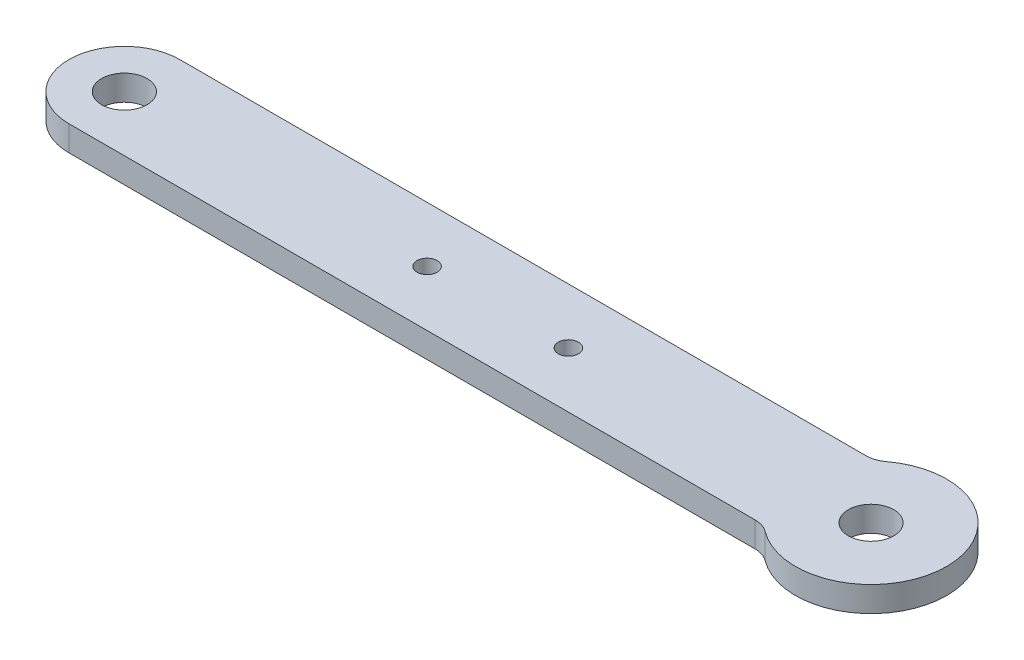
ISO-10303-21;
HEADER;
FILE_DESCRIPTION(('STEP AP214'),'2;1');
FILE_NAME('part.step','',(''),(''),'','','');
FILE_SCHEMA(('AUTOMOTIVE_DESIGN { 1 0 10303 214 1 1 1 1 }'));
ENDSEC;
DATA;
#1=APPLICATION_CONTEXT('core data for automotive mechanical design processes');
#2=APPLICATION_PROTOCOL_DEFINITION('international standard','automotive_design',2000,#1);
#3=PRODUCT_CONTEXT('',#1,'mechanical');
#4=PRODUCT('Part','Part','',(#3));
#5=PRODUCT_RELATED_PRODUCT_CATEGORY('part','',(#4));
#6=PRODUCT_DEFINITION_FORMATION('','',#4);
#7=PRODUCT_DEFINITION_CONTEXT('part definition',#1,'design');
#8=PRODUCT_DEFINITION('design','',#6,#7);
#9=PRODUCT_DEFINITION_SHAPE('','',#8);
#10=(LENGTH_UNIT() NAMED_UNIT(*) SI_UNIT(.MILLI.,.METRE.));
#11=(NAMED_UNIT(*) PLANE_ANGLE_UNIT() SI_UNIT($,.RADIAN.));
#12=(NAMED_UNIT(*) SI_UNIT($,.STERADIAN.) SOLID_ANGLE_UNIT());
#13=UNCERTAINTY_MEASURE_WITH_UNIT(LENGTH_MEASURE(1.E-05),#10,'distance_accuracy_value','');
#14=(GEOMETRIC_REPRESENTATION_CONTEXT(3) GLOBAL_UNCERTAINTY_ASSIGNED_CONTEXT((#13)) GLOBAL_UNIT_ASSIGNED_CONTEXT((#10,
#11,#12)) REPRESENTATION_CONTEXT('',''));
#15=CARTESIAN_POINT('',(0.,0.,0.));
#16=DIRECTION('',(0.,0.,1.));
#17=DIRECTION('',(1.,0.,0.));
#18=AXIS2_PLACEMENT_3D('',#15,#16,#17);
#19=CARTESIAN_POINT('',(-64.2326621923937,5.,-8.03803131991051));
#20=DIRECTION('',(0.,1.,0.));
#21=DIRECTION('',(0.,0.,1.));
#22=AXIS2_PLACEMENT_3D('',#19,#20,#21);
#23=PLANE('',#22);
#24=CARTESIAN_POINT('',(-4.23266219239372,5.,-8.03803131991051));
#25=DIRECTION('',(0.,1.,0.));
#26=DIRECTION('',(0.,0.,1.));
#27=AXIS2_PLACEMENT_3D('',#24,#25,#26);
#28=CIRCLE('',#27,2.);
#29=CARTESIAN_POINT('',(-4.23266219239372,5.,-6.03803131991051));
#30=VERTEX_POINT('',#29);
#31=EDGE_CURVE('E193',#30,#30,#28,.T.);
#32=ORIENTED_EDGE('',*,*,#31,.F.);
#33=EDGE_LOOP('',(#32));
#34=FACE_BOUND('',#33,.T.);
#35=CARTESIAN_POINT('',(-64.2326621923937,5.,-8.03803131991051));
#36=DIRECTION('',(0.,1.,0.));
#37=DIRECTION('',(0.,0.,1.));
#38=AXIS2_PLACEMENT_3D('',#35,#36,#37);
#39=CIRCLE('',#38,4.5);
#40=CARTESIAN_POINT('',(-64.2326621923937,5.,-3.53803131991051));
#41=VERTEX_POINT('',#40);
#42=EDGE_CURVE('E126',#41,#41,#39,.T.);
#43=ORIENTED_EDGE('',*,*,#42,.F.);
#44=EDGE_LOOP('',(#43));
#45=FACE_BOUND('',#44,.T.);
#46=CARTESIAN_POINT('',(-64.2326621923937,5.,-8.03803131991051));
#47=DIRECTION('',(0.,1.,0.));
#48=DIRECTION('',(0.,0.,1.));
#49=AXIS2_PLACEMENT_3D('',#46,#47,#48);
#50=CIRCLE('',#49,11.);
#51=CARTESIAN_POINT('',(-64.2326621923937,5.,-19.0380313199105));
#52=VERTEX_POINT('',#51);
#53=CARTESIAN_POINT('',(-64.2326621923937,5.,2.96196868008949));
#54=VERTEX_POINT('',#53);
#55=EDGE_CURVE('E133',#52,#54,#50,.T.);
#56=ORIENTED_EDGE('',*,*,#55,.T.);
#57=DIRECTION('',(1.,0.,0.));
#58=VECTOR('',#57,1.);
#59=CARTESIAN_POINT('',(71.7673378076063,5.,2.96196868008949));
#60=LINE('',#59,#58);
#61=CARTESIAN_POINT('',(71.7673378076063,5.,2.96196868008949));
#62=VERTEX_POINT('',#61);
#63=EDGE_CURVE('E91',#54,#62,#60,.T.);
#64=ORIENTED_EDGE('',*,*,#63,.T.);
#65=CARTESIAN_POINT('',(71.7673378076063,5.,7.96196868008949));
#66=DIRECTION('',(0.,-1.,0.));
#67=DIRECTION('',(0.,0.,-1.));
#68=AXIS2_PLACEMENT_3D('',#65,#66,#67);
#69=CIRCLE('',#68,5.);
#70=CARTESIAN_POINT('',(74.7673378076063,5.,3.96196868008949));
#71=VERTEX_POINT('',#70);
#72=EDGE_CURVE('E104',#62,#71,#69,.T.);
#73=ORIENTED_EDGE('',*,*,#72,.T.);
#74=CARTESIAN_POINT('',(83.7673378076063,5.,-8.03803131991051));
#75=DIRECTION('',(0.,1.,0.));
#76=DIRECTION('',(0.,0.,1.));
#77=AXIS2_PLACEMENT_3D('',#74,#75,#76);
#78=CIRCLE('',#77,15.);
#79=CARTESIAN_POINT('',(74.7673378076063,5.,-20.0380313199105));
#80=VERTEX_POINT('',#79);
#81=EDGE_CURVE('E98',#71,#80,#78,.T.);
#82=ORIENTED_EDGE('',*,*,#81,.T.);
#83=CARTESIAN_POINT('',(71.7673378076063,5.,-24.0380313199105));
#84=DIRECTION('',(0.,-1.,0.));
#85=DIRECTION('',(0.,0.,1.));
#86=AXIS2_PLACEMENT_3D('',#83,#84,#85);
#87=CIRCLE('',#86,5.);
#88=CARTESIAN_POINT('',(71.7673378076063,5.,-19.0380313199105));
#89=VERTEX_POINT('',#88);
#90=EDGE_CURVE('E102',#80,#89,#87,.T.);
#91=ORIENTED_EDGE('',*,*,#90,.T.);
#92=DIRECTION('',(-1.,0.,0.));
#93=VECTOR('',#92,1.);
#94=CARTESIAN_POINT('',(-64.2326621923937,5.,-19.0380313199105));
#95=LINE('',#94,#93);
#96=EDGE_CURVE('E54',#89,#52,#95,.T.);
#97=ORIENTED_EDGE('',*,*,#96,.T.);
#98=EDGE_LOOP('',(#56,#64,#73,#82,#91,#97));
#99=FACE_BOUND('',#98,.T.);
#100=CARTESIAN_POINT('',(83.7673378076063,5.,-8.03803131991051));
#101=DIRECTION('',(0.,1.,0.));
#102=DIRECTION('',(0.,0.,1.));
#103=AXIS2_PLACEMENT_3D('',#100,#101,#102);
#104=CIRCLE('',#103,4.5);
#105=CARTESIAN_POINT('',(83.7673378076063,5.,-3.5380313199105));
#106=VERTEX_POINT('',#105);
#107=EDGE_CURVE('E199',#106,#106,#104,.T.);
#108=ORIENTED_EDGE('',*,*,#107,.F.);
#109=EDGE_LOOP('',(#108));
#110=FACE_BOUND('',#109,.T.);
#111=CARTESIAN_POINT('',(23.7673378076063,5.,-8.03803131991051));
#112=DIRECTION('',(0.,1.,0.));
#113=DIRECTION('',(0.,0.,1.));
#114=AXIS2_PLACEMENT_3D('',#111,#112,#113);
#115=CIRCLE('',#114,2.);
#116=CARTESIAN_POINT('',(23.7673378076063,5.,-6.03803131991051));
#117=VERTEX_POINT('',#116);
#118=EDGE_CURVE('E184',#117,#117,#115,.T.);
#119=ORIENTED_EDGE('',*,*,#118,.F.);
#120=EDGE_LOOP('',(#119));
#121=FACE_BOUND('',#120,.T.);
#122=ADVANCED_FACE('F37',(#34,#45,#99,#110,#121),#23,.T.);
#123=CARTESIAN_POINT('',(-64.2326621923937,0.,-8.03803131991051));
#124=DIRECTION('',(0.,1.,0.));
#125=DIRECTION('',(0.,0.,1.));
#126=AXIS2_PLACEMENT_3D('',#123,#124,#125);
#127=PLANE('',#126);
#128=CARTESIAN_POINT('',(-64.2326621923937,0.,-8.03803131991051));
#129=DIRECTION('',(0.,1.,0.));
#130=DIRECTION('',(0.,0.,1.));
#131=AXIS2_PLACEMENT_3D('',#128,#129,#130);
#132=CIRCLE('',#131,11.);
#133=CARTESIAN_POINT('',(-64.2326621923937,0.,-19.0380313199105));
#134=VERTEX_POINT('',#133);
#135=CARTESIAN_POINT('',(-64.2326621923937,0.,2.96196868008949));
#136=VERTEX_POINT('',#135);
#137=EDGE_CURVE('E122',#134,#136,#132,.T.);
#138=ORIENTED_EDGE('',*,*,#137,.F.);
#139=DIRECTION('',(-1.,0.,0.));
#140=VECTOR('',#139,1.);
#141=CARTESIAN_POINT('',(-64.2326621923937,0.,-19.0380313199105));
#142=LINE('',#141,#140);
#143=CARTESIAN_POINT('',(71.7673378076063,0.,-19.0380313199105));
#144=VERTEX_POINT('',#143);
#145=EDGE_CURVE('E83',#144,#134,#142,.T.);
#146=ORIENTED_EDGE('',*,*,#145,.F.);
#147=CARTESIAN_POINT('',(71.7673378076063,0.,-24.0380313199105));
#148=DIRECTION('',(0.,-1.,0.));
#149=DIRECTION('',(0.,0.,1.));
#150=AXIS2_PLACEMENT_3D('',#147,#148,#149);
#151=CIRCLE('',#150,5.);
#152=CARTESIAN_POINT('',(74.7673378076063,0.,-20.0380313199105));
#153=VERTEX_POINT('',#152);
#154=EDGE_CURVE('E77',#153,#144,#151,.T.);
#155=ORIENTED_EDGE('',*,*,#154,.F.);
#156=CARTESIAN_POINT('',(83.7673378076063,0.,-8.03803131991051));
#157=DIRECTION('',(0.,1.,0.));
#158=DIRECTION('',(0.,0.,1.));
#159=AXIS2_PLACEMENT_3D('',#156,#157,#158);
#160=CIRCLE('',#159,15.);
#161=CARTESIAN_POINT('',(74.7673378076063,0.,3.96196868008949));
#162=VERTEX_POINT('',#161);
#163=EDGE_CURVE('E112',#162,#153,#160,.T.);
#164=ORIENTED_EDGE('',*,*,#163,.F.);
#165=CARTESIAN_POINT('',(71.7673378076063,0.,7.96196868008949));
#166=DIRECTION('',(0.,-1.,0.));
#167=DIRECTION('',(0.,0.,-1.));
#168=AXIS2_PLACEMENT_3D('',#165,#166,#167);
#169=CIRCLE('',#168,5.);
#170=CARTESIAN_POINT('',(71.7673378076063,0.,2.96196868008949));
#171=VERTEX_POINT('',#170);
#172=EDGE_CURVE('E128',#171,#162,#169,.T.);
#173=ORIENTED_EDGE('',*,*,#172,.F.);
#174=DIRECTION('',(1.,0.,0.));
#175=VECTOR('',#174,1.);
#176=CARTESIAN_POINT('',(71.7673378076063,0.,2.96196868008949));
#177=LINE('',#176,#175);
#178=EDGE_CURVE('E125',#136,#171,#177,.T.);
#179=ORIENTED_EDGE('',*,*,#178,.F.);
#180=EDGE_LOOP('',(#138,#146,#155,#164,#173,#179));
#181=FACE_BOUND('',#180,.T.);
#182=CARTESIAN_POINT('',(-64.2326621923937,0.,-8.03803131991051));
#183=DIRECTION('',(0.,1.,0.));
#184=DIRECTION('',(0.,0.,1.));
#185=AXIS2_PLACEMENT_3D('',#182,#183,#184);
#186=CIRCLE('',#185,4.5);
#187=CARTESIAN_POINT('',(-64.2326621923937,0.,-3.53803131991051));
#188=VERTEX_POINT('',#187);
#189=EDGE_CURVE('E202',#188,#188,#186,.T.);
#190=ORIENTED_EDGE('',*,*,#189,.T.);
#191=EDGE_LOOP('',(#190));
#192=FACE_BOUND('',#191,.T.);
#193=CARTESIAN_POINT('',(83.7673378076063,0.,-8.03803131991051));
#194=DIRECTION('',(0.,1.,0.));
#195=DIRECTION('',(0.,0.,1.));
#196=AXIS2_PLACEMENT_3D('',#193,#194,#195);
#197=CIRCLE('',#196,4.5);
#198=CARTESIAN_POINT('',(83.7673378076063,0.,-3.5380313199105));
#199=VERTEX_POINT('',#198);
#200=EDGE_CURVE('E196',#199,#199,#197,.T.);
#201=ORIENTED_EDGE('',*,*,#200,.T.);
#202=EDGE_LOOP('',(#201));
#203=FACE_BOUND('',#202,.T.);
#204=CARTESIAN_POINT('',(-4.23266219239372,0.,-8.03803131991051));
#205=DIRECTION('',(0.,1.,0.));
#206=DIRECTION('',(0.,0.,1.));
#207=AXIS2_PLACEMENT_3D('',#204,#205,#206);
#208=CIRCLE('',#207,2.);
#209=CARTESIAN_POINT('',(-4.23266219239372,0.,-6.03803131991051));
#210=VERTEX_POINT('',#209);
#211=EDGE_CURVE('E190',#210,#210,#208,.T.);
#212=ORIENTED_EDGE('',*,*,#211,.T.);
#213=EDGE_LOOP('',(#212));
#214=FACE_BOUND('',#213,.T.);
#215=CARTESIAN_POINT('',(23.7673378076063,0.,-8.03803131991051));
#216=DIRECTION('',(0.,1.,0.));
#217=DIRECTION('',(0.,0.,1.));
#218=AXIS2_PLACEMENT_3D('',#215,#216,#217);
#219=CIRCLE('',#218,2.);
#220=CARTESIAN_POINT('',(23.7673378076063,0.,-6.03803131991051));
#221=VERTEX_POINT('',#220);
#222=EDGE_CURVE('E187',#221,#221,#219,.T.);
#223=ORIENTED_EDGE('',*,*,#222,.T.);
#224=EDGE_LOOP('',(#223));
#225=FACE_BOUND('',#224,.T.);
#226=ADVANCED_FACE('F142',(#181,#192,#203,#214,#225),#127,.F.);
#227=CARTESIAN_POINT('',(-64.2326621923937,5.,-8.03803131991051));
#228=DIRECTION('',(0.,-1.,0.));
#229=DIRECTION('',(0.,0.,-1.));
#230=AXIS2_PLACEMENT_3D('',#227,#228,#229);
#231=CYLINDRICAL_SURFACE('',#230,11.);
#232=ORIENTED_EDGE('',*,*,#137,.T.);
#233=DIRECTION('',(0.,-1.,0.));
#234=VECTOR('',#233,1.);
#235=CARTESIAN_POINT('',(-64.2326621923937,5.,2.96196868008949));
#236=LINE('',#235,#234);
#237=EDGE_CURVE('E11',#54,#136,#236,.T.);
#238=ORIENTED_EDGE('',*,*,#237,.F.);
#239=ORIENTED_EDGE('',*,*,#55,.F.);
#240=DIRECTION('',(0.,-1.,0.));
#241=VECTOR('',#240,1.);
#242=CARTESIAN_POINT('',(-64.2326621923937,5.,-19.0380313199105));
#243=LINE('',#242,#241);
#244=EDGE_CURVE('E118',#52,#134,#243,.T.);
#245=ORIENTED_EDGE('',*,*,#244,.T.);
#246=EDGE_LOOP('',(#232,#238,#239,#245));
#247=FACE_BOUND('',#246,.T.);
#248=ADVANCED_FACE('F39',(#247),#231,.T.);
#249=CARTESIAN_POINT('',(71.7673378076063,5.,2.96196868008949));
#250=DIRECTION('',(0.,0.,-1.));
#251=DIRECTION('',(-1.,0.,0.));
#252=AXIS2_PLACEMENT_3D('',#249,#250,#251);
#253=PLANE('',#252);
#254=ORIENTED_EDGE('',*,*,#178,.T.);
#255=DIRECTION('',(0.,-1.,0.));
#256=VECTOR('',#255,1.);
#257=CARTESIAN_POINT('',(71.7673378076063,5.,2.96196868008949));
#258=LINE('',#257,#256);
#259=EDGE_CURVE('E46',#62,#171,#258,.T.);
#260=ORIENTED_EDGE('',*,*,#259,.F.);
#261=ORIENTED_EDGE('',*,*,#63,.F.);
#262=ORIENTED_EDGE('',*,*,#237,.T.);
#263=EDGE_LOOP('',(#254,#260,#261,#262));
#264=FACE_BOUND('',#263,.T.);
#265=ADVANCED_FACE('F260',(#264),#253,.F.);
#266=CARTESIAN_POINT('',(71.7673378076063,5.,7.96196868008949));
#267=DIRECTION('',(0.,-1.,0.));
#268=DIRECTION('',(0.,0.,-1.));
#269=AXIS2_PLACEMENT_3D('',#266,#267,#268);
#270=CYLINDRICAL_SURFACE('',#269,5.);
#271=ORIENTED_EDGE('',*,*,#172,.T.);
#272=DIRECTION('',(0.,-1.,0.));
#273=VECTOR('',#272,1.);
#274=CARTESIAN_POINT('',(74.7673378076063,5.,3.96196868008949));
#275=LINE('',#274,#273);
#276=EDGE_CURVE('E113',#71,#162,#275,.T.);
#277=ORIENTED_EDGE('',*,*,#276,.F.);
#278=ORIENTED_EDGE('',*,*,#72,.F.);
#279=ORIENTED_EDGE('',*,*,#259,.T.);
#280=EDGE_LOOP('',(#271,#277,#278,#279));
#281=FACE_BOUND('',#280,.T.);
#282=ADVANCED_FACE('F139',(#281),#270,.F.);
#283=CARTESIAN_POINT('',(83.7673378076063,5.,-8.03803131991051));
#284=DIRECTION('',(0.,-1.,0.));
#285=DIRECTION('',(0.,0.,-1.));
#286=AXIS2_PLACEMENT_3D('',#283,#284,#285);
#287=CYLINDRICAL_SURFACE('',#286,15.);
#288=ORIENTED_EDGE('',*,*,#163,.T.);
#289=DIRECTION('',(0.,-1.,0.));
#290=VECTOR('',#289,1.);
#291=CARTESIAN_POINT('',(74.7673378076063,5.,-20.0380313199105));
#292=LINE('',#291,#290);
#293=EDGE_CURVE('E109',#80,#153,#292,.T.);
#294=ORIENTED_EDGE('',*,*,#293,.F.);
#295=ORIENTED_EDGE('',*,*,#81,.F.);
#296=ORIENTED_EDGE('',*,*,#276,.T.);
#297=EDGE_LOOP('',(#288,#294,#295,#296));
#298=FACE_BOUND('',#297,.T.);
#299=ADVANCED_FACE('F110',(#298),#287,.T.);
#300=CARTESIAN_POINT('',(71.7673378076063,5.,-24.0380313199105));
#301=DIRECTION('',(0.,-1.,0.));
#302=DIRECTION('',(0.,0.,-1.));
#303=AXIS2_PLACEMENT_3D('',#300,#301,#302);
#304=CYLINDRICAL_SURFACE('',#303,5.);
#305=ORIENTED_EDGE('',*,*,#154,.T.);
#306=DIRECTION('',(0.,-1.,0.));
#307=VECTOR('',#306,1.);
#308=CARTESIAN_POINT('',(71.7673378076063,5.,-19.0380313199105));
#309=LINE('',#308,#307);
#310=EDGE_CURVE('E114',#89,#144,#309,.T.);
#311=ORIENTED_EDGE('',*,*,#310,.F.);
#312=ORIENTED_EDGE('',*,*,#90,.F.);
#313=ORIENTED_EDGE('',*,*,#293,.T.);
#314=EDGE_LOOP('',(#305,#311,#312,#313));
#315=FACE_BOUND('',#314,.T.);
#316=ADVANCED_FACE('F116',(#315),#304,.F.);
#317=CARTESIAN_POINT('',(-64.2326621923937,5.,-19.0380313199105));
#318=DIRECTION('',(0.,0.,1.));
#319=DIRECTION('',(1.,0.,0.));
#320=AXIS2_PLACEMENT_3D('',#317,#318,#319);
#321=PLANE('',#320);
#322=ORIENTED_EDGE('',*,*,#145,.T.);
#323=ORIENTED_EDGE('',*,*,#244,.F.);
#324=ORIENTED_EDGE('',*,*,#96,.F.);
#325=ORIENTED_EDGE('',*,*,#310,.T.);
#326=EDGE_LOOP('',(#322,#323,#324,#325));
#327=FACE_BOUND('',#326,.T.);
#328=ADVANCED_FACE('F147',(#327),#321,.F.);
#329=CARTESIAN_POINT('',(-64.2326621923937,5.,-8.03803131991051));
#330=DIRECTION('',(0.,-1.,0.));
#331=DIRECTION('',(0.,0.,-1.));
#332=AXIS2_PLACEMENT_3D('',#329,#330,#331);
#333=CYLINDRICAL_SURFACE('',#332,4.5);
#334=ORIENTED_EDGE('',*,*,#42,.T.);
#335=EDGE_LOOP('',(#334));
#336=FACE_BOUND('',#335,.T.);
#337=ORIENTED_EDGE('',*,*,#189,.F.);
#338=EDGE_LOOP('',(#337));
#339=FACE_BOUND('',#338,.T.);
#340=ADVANCED_FACE('F149',(#336,#339),#333,.F.);
#341=CARTESIAN_POINT('',(83.7673378076063,5.,-8.03803131991051));
#342=DIRECTION('',(0.,-1.,0.));
#343=DIRECTION('',(0.,0.,-1.));
#344=AXIS2_PLACEMENT_3D('',#341,#342,#343);
#345=CYLINDRICAL_SURFACE('',#344,4.5);
#346=ORIENTED_EDGE('',*,*,#107,.T.);
#347=EDGE_LOOP('',(#346));
#348=FACE_BOUND('',#347,.T.);
#349=ORIENTED_EDGE('',*,*,#200,.F.);
#350=EDGE_LOOP('',(#349));
#351=FACE_BOUND('',#350,.T.);
#352=ADVANCED_FACE('F155',(#348,#351),#345,.F.);
#353=CARTESIAN_POINT('',(-4.23266219239372,5.,-8.03803131991051));
#354=DIRECTION('',(0.,-1.,0.));
#355=DIRECTION('',(0.,0.,-1.));
#356=AXIS2_PLACEMENT_3D('',#353,#354,#355);
#357=CYLINDRICAL_SURFACE('',#356,2.);
#358=ORIENTED_EDGE('',*,*,#31,.T.);
#359=EDGE_LOOP('',(#358));
#360=FACE_BOUND('',#359,.T.);
#361=ORIENTED_EDGE('',*,*,#211,.F.);
#362=EDGE_LOOP('',(#361));
#363=FACE_BOUND('',#362,.T.);
#364=ADVANCED_FACE('F171',(#360,#363),#357,.F.);
#365=CARTESIAN_POINT('',(23.7673378076063,5.,-8.03803131991051));
#366=DIRECTION('',(0.,-1.,0.));
#367=DIRECTION('',(0.,0.,-1.));
#368=AXIS2_PLACEMENT_3D('',#365,#366,#367);
#369=CYLINDRICAL_SURFACE('',#368,2.);
#370=ORIENTED_EDGE('',*,*,#118,.T.);
#371=EDGE_LOOP('',(#370));
#372=FACE_BOUND('',#371,.T.);
#373=ORIENTED_EDGE('',*,*,#222,.F.);
#374=EDGE_LOOP('',(#373));
#375=FACE_BOUND('',#374,.T.);
#376=ADVANCED_FACE('F175',(#372,#375),#369,.F.);
#377=CLOSED_SHELL('',(#122,#226,#248,#265,#282,#299,#316,#328,#340,#352,#364,#376));
#378=MANIFOLD_SOLID_BREP('B2',#377);
#379=ADVANCED_BREP_SHAPE_REPRESENTATION('',(#18,#378),#14);
#380=SHAPE_DEFINITION_REPRESENTATION(#9,#379);
ENDSEC;
END-ISO-10303-21;
